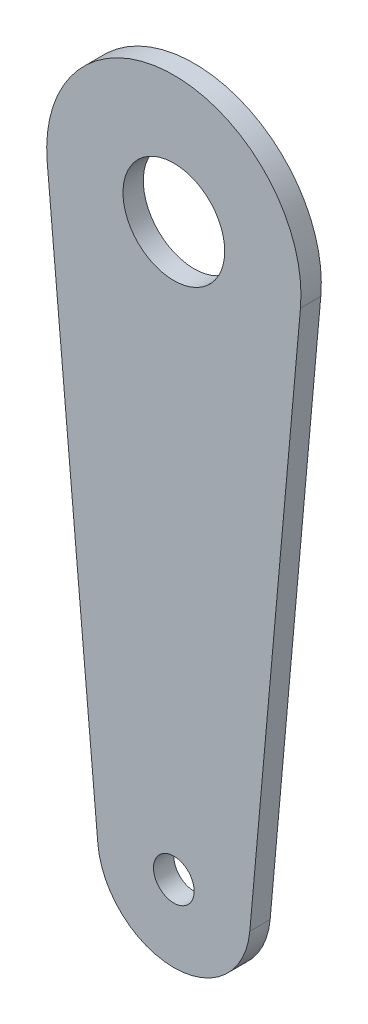
ISO-10303-21;
HEADER;
FILE_DESCRIPTION(('STEP AP214'),'2;1');
FILE_NAME('part.step','',(''),(''),'','','');
FILE_SCHEMA(('AUTOMOTIVE_DESIGN { 1 0 10303 214 1 1 1 1 }'));
ENDSEC;
DATA;
#1=APPLICATION_CONTEXT('core data for automotive mechanical design processes');
#2=APPLICATION_PROTOCOL_DEFINITION('international standard','automotive_design',2000,#1);
#3=PRODUCT_CONTEXT('',#1,'mechanical');
#4=PRODUCT('Part','Part','',(#3));
#5=PRODUCT_RELATED_PRODUCT_CATEGORY('part','',(#4));
#6=PRODUCT_DEFINITION_FORMATION('','',#4);
#7=PRODUCT_DEFINITION_CONTEXT('part definition',#1,'design');
#8=PRODUCT_DEFINITION('design','',#6,#7);
#9=PRODUCT_DEFINITION_SHAPE('','',#8);
#10=(LENGTH_UNIT() NAMED_UNIT(*) SI_UNIT(.MILLI.,.METRE.));
#11=(NAMED_UNIT(*) PLANE_ANGLE_UNIT() SI_UNIT($,.RADIAN.));
#12=(NAMED_UNIT(*) SI_UNIT($,.STERADIAN.) SOLID_ANGLE_UNIT());
#13=UNCERTAINTY_MEASURE_WITH_UNIT(LENGTH_MEASURE(1.E-05),#10,'distance_accuracy_value','');
#14=(GEOMETRIC_REPRESENTATION_CONTEXT(3) GLOBAL_UNCERTAINTY_ASSIGNED_CONTEXT((#13)) GLOBAL_UNIT_ASSIGNED_CONTEXT((#10,
#11,#12)) REPRESENTATION_CONTEXT('',''));
#15=CARTESIAN_POINT('',(0.,0.,0.));
#16=DIRECTION('',(0.,0.,1.));
#17=DIRECTION('',(1.,0.,0.));
#18=AXIS2_PLACEMENT_3D('',#15,#16,#17);
#19=CARTESIAN_POINT('',(15.9694452940245,-1.43156090561225,4.));
#20=DIRECTION('',(-0.996006054813167,0.0892857142857142,0.));
#21=DIRECTION('',(-0.0892857142857142,-0.996006054813167,0.));
#22=AXIS2_PLACEMENT_3D('',#19,#20,#21);
#23=PLANE('',#22);
#24=DIRECTION('',(0.0892857142857142,0.996006054813167,0.));
#25=VECTOR('',#24,1.);
#26=CARTESIAN_POINT('',(15.9694452940245,-1.43156090561225,0.));
#27=LINE('',#26,#25);
#28=CARTESIAN_POINT('',(14.9400908221975,-12.9142857142857,0.));
#29=VERTEX_POINT('',#28);
#30=CARTESIAN_POINT('',(24.9001513703292,98.1928571428572,0.));
#31=VERTEX_POINT('',#30);
#32=EDGE_CURVE('E121',#29,#31,#27,.T.);
#33=ORIENTED_EDGE('',*,*,#32,.T.);
#34=DIRECTION('',(0.,0.,-1.));
#35=VECTOR('',#34,1.);
#36=CARTESIAN_POINT('',(24.9001513703292,98.1928571428572,4.));
#37=LINE('',#36,#35);
#38=CARTESIAN_POINT('',(24.9001513703292,98.1928571428572,4.));
#39=VERTEX_POINT('',#38);
#40=EDGE_CURVE('E11',#39,#31,#37,.T.);
#41=ORIENTED_EDGE('',*,*,#40,.F.);
#42=DIRECTION('',(0.0892857142857142,0.996006054813167,0.));
#43=VECTOR('',#42,1.);
#44=CARTESIAN_POINT('',(15.9694452940245,-1.43156090561225,4.));
#45=LINE('',#44,#43);
#46=CARTESIAN_POINT('',(14.9400908221975,-12.9142857142857,4.));
#47=VERTEX_POINT('',#46);
#48=EDGE_CURVE('E96',#47,#39,#45,.T.);
#49=ORIENTED_EDGE('',*,*,#48,.F.);
#50=DIRECTION('',(0.,0.,-1.));
#51=VECTOR('',#50,1.);
#52=CARTESIAN_POINT('',(14.9400908221975,-12.9142857142857,4.));
#53=LINE('',#52,#51);
#54=EDGE_CURVE('E112',#47,#29,#53,.T.);
#55=ORIENTED_EDGE('',*,*,#54,.T.);
#56=EDGE_LOOP('',(#33,#41,#49,#55));
#57=FACE_BOUND('',#56,.T.);
#58=ADVANCED_FACE('F50',(#57),#23,.F.);
#59=CARTESIAN_POINT('',(0.,100.425,4.));
#60=DIRECTION('',(0.,0.,-1.));
#61=DIRECTION('',(-1.,0.,0.));
#62=AXIS2_PLACEMENT_3D('',#59,#60,#61);
#63=CYLINDRICAL_SURFACE('',#62,25.);
#64=CARTESIAN_POINT('',(0.,100.425,0.));
#65=DIRECTION('',(0.,0.,1.));
#66=DIRECTION('',(1.,0.,0.));
#67=AXIS2_PLACEMENT_3D('',#64,#65,#66);
#68=CIRCLE('',#67,25.);
#69=CARTESIAN_POINT('',(-24.9001513703292,98.1928571428572,0.));
#70=VERTEX_POINT('',#69);
#71=EDGE_CURVE('E105',#31,#70,#68,.T.);
#72=ORIENTED_EDGE('',*,*,#71,.T.);
#73=DIRECTION('',(0.,0.,-1.));
#74=VECTOR('',#73,1.);
#75=CARTESIAN_POINT('',(-24.9001513703292,98.1928571428572,4.));
#76=LINE('',#75,#74);
#77=CARTESIAN_POINT('',(-24.9001513703292,98.1928571428572,4.));
#78=VERTEX_POINT('',#77);
#79=EDGE_CURVE('E60',#78,#70,#76,.T.);
#80=ORIENTED_EDGE('',*,*,#79,.F.);
#81=CARTESIAN_POINT('',(0.,100.425,4.));
#82=DIRECTION('',(0.,0.,1.));
#83=DIRECTION('',(1.,0.,0.));
#84=AXIS2_PLACEMENT_3D('',#81,#82,#83);
#85=CIRCLE('',#84,25.);
#86=EDGE_CURVE('E91',#39,#78,#85,.T.);
#87=ORIENTED_EDGE('',*,*,#86,.F.);
#88=ORIENTED_EDGE('',*,*,#40,.T.);
#89=EDGE_LOOP('',(#72,#80,#87,#88));
#90=FACE_BOUND('',#89,.T.);
#91=ADVANCED_FACE('F102',(#90),#63,.T.);
#92=CARTESIAN_POINT('',(-15.9694452940245,-1.43156090561225,4.));
#93=DIRECTION('',(-0.996006054813167,-0.0892857142857145,0.));
#94=DIRECTION('',(0.0892857142857145,-0.996006054813167,0.));
#95=AXIS2_PLACEMENT_3D('',#92,#93,#94);
#96=PLANE('',#95);
#97=DIRECTION('',(-0.0892857142857144,0.996006054813167,0.));
#98=VECTOR('',#97,1.);
#99=CARTESIAN_POINT('',(-15.9694452940245,-1.43156090561225,0.));
#100=LINE('',#99,#98);
#101=CARTESIAN_POINT('',(-14.9400908221975,-12.9142857142857,0.));
#102=VERTEX_POINT('',#101);
#103=EDGE_CURVE('E129',#102,#70,#100,.T.);
#104=ORIENTED_EDGE('',*,*,#103,.F.);
#105=DIRECTION('',(0.,0.,-1.));
#106=VECTOR('',#105,1.);
#107=CARTESIAN_POINT('',(-14.9400908221975,-12.9142857142857,4.));
#108=LINE('',#107,#106);
#109=CARTESIAN_POINT('',(-14.9400908221975,-12.9142857142857,4.));
#110=VERTEX_POINT('',#109);
#111=EDGE_CURVE('E83',#110,#102,#108,.T.);
#112=ORIENTED_EDGE('',*,*,#111,.F.);
#113=DIRECTION('',(-0.0892857142857144,0.996006054813167,0.));
#114=VECTOR('',#113,1.);
#115=CARTESIAN_POINT('',(-15.9694452940245,-1.43156090561225,4.));
#116=LINE('',#115,#114);
#117=EDGE_CURVE('E92',#110,#78,#116,.T.);
#118=ORIENTED_EDGE('',*,*,#117,.T.);
#119=ORIENTED_EDGE('',*,*,#79,.T.);
#120=EDGE_LOOP('',(#104,#112,#118,#119));
#121=FACE_BOUND('',#120,.T.);
#122=ADVANCED_FACE('F110',(#121),#96,.T.);
#123=CARTESIAN_POINT('',(0.,100.425,4.));
#124=DIRECTION('',(0.,0.,-1.));
#125=DIRECTION('',(-1.,0.,0.));
#126=AXIS2_PLACEMENT_3D('',#123,#124,#125);
#127=CYLINDRICAL_SURFACE('',#126,10.);
#128=CARTESIAN_POINT('',(0.,100.425,4.));
#129=DIRECTION('',(0.,0.,1.));
#130=DIRECTION('',(1.,0.,0.));
#131=AXIS2_PLACEMENT_3D('',#128,#129,#130);
#132=CIRCLE('',#131,10.);
#133=CARTESIAN_POINT('',(10.,100.425,4.));
#134=VERTEX_POINT('',#133);
#135=EDGE_CURVE('E173',#134,#134,#132,.T.);
#136=ORIENTED_EDGE('',*,*,#135,.T.);
#137=EDGE_LOOP('',(#136));
#138=FACE_BOUND('',#137,.T.);
#139=CARTESIAN_POINT('',(0.,100.425,0.));
#140=DIRECTION('',(0.,0.,1.));
#141=DIRECTION('',(1.,0.,0.));
#142=AXIS2_PLACEMENT_3D('',#139,#140,#141);
#143=CIRCLE('',#142,10.);
#144=CARTESIAN_POINT('',(10.,100.425,0.));
#145=VERTEX_POINT('',#144);
#146=EDGE_CURVE('E117',#145,#145,#143,.T.);
#147=ORIENTED_EDGE('',*,*,#146,.F.);
#148=EDGE_LOOP('',(#147));
#149=FACE_BOUND('',#148,.T.);
#150=ADVANCED_FACE('F158',(#138,#149),#127,.F.);
#151=CARTESIAN_POINT('',(0.,-11.575,4.));
#152=DIRECTION('',(0.,0.,-1.));
#153=DIRECTION('',(-1.,0.,0.));
#154=AXIS2_PLACEMENT_3D('',#151,#152,#153);
#155=CYLINDRICAL_SURFACE('',#154,4.);
#156=CARTESIAN_POINT('',(0.,-11.575,4.));
#157=DIRECTION('',(0.,0.,1.));
#158=DIRECTION('',(1.,0.,0.));
#159=AXIS2_PLACEMENT_3D('',#156,#157,#158);
#160=CIRCLE('',#159,4.);
#161=CARTESIAN_POINT('',(4.00000000000001,-11.575,4.));
#162=VERTEX_POINT('',#161);
#163=EDGE_CURVE('E132',#162,#162,#160,.T.);
#164=ORIENTED_EDGE('',*,*,#163,.T.);
#165=EDGE_LOOP('',(#164));
#166=FACE_BOUND('',#165,.T.);
#167=CARTESIAN_POINT('',(0.,-11.575,0.));
#168=DIRECTION('',(0.,0.,1.));
#169=DIRECTION('',(1.,0.,0.));
#170=AXIS2_PLACEMENT_3D('',#167,#168,#169);
#171=CIRCLE('',#170,4.);
#172=CARTESIAN_POINT('',(4.00000000000001,-11.575,0.));
#173=VERTEX_POINT('',#172);
#174=EDGE_CURVE('E113',#173,#173,#171,.T.);
#175=ORIENTED_EDGE('',*,*,#174,.F.);
#176=EDGE_LOOP('',(#175));
#177=FACE_BOUND('',#176,.T.);
#178=ADVANCED_FACE('F47',(#166,#177),#155,.F.);
#179=CARTESIAN_POINT('',(0.,-11.575,4.));
#180=DIRECTION('',(0.,0.,-1.));
#181=DIRECTION('',(-1.,0.,0.));
#182=AXIS2_PLACEMENT_3D('',#179,#180,#181);
#183=CYLINDRICAL_SURFACE('',#182,15.);
#184=CARTESIAN_POINT('',(0.,-11.575,0.));
#185=DIRECTION('',(0.,0.,1.));
#186=DIRECTION('',(1.,0.,0.));
#187=AXIS2_PLACEMENT_3D('',#184,#185,#186);
#188=CIRCLE('',#187,15.);
#189=EDGE_CURVE('E84',#102,#29,#188,.T.);
#190=ORIENTED_EDGE('',*,*,#189,.T.);
#191=ORIENTED_EDGE('',*,*,#54,.F.);
#192=CARTESIAN_POINT('',(0.,-11.575,4.));
#193=DIRECTION('',(0.,0.,1.));
#194=DIRECTION('',(1.,0.,0.));
#195=AXIS2_PLACEMENT_3D('',#192,#193,#194);
#196=CIRCLE('',#195,15.);
#197=EDGE_CURVE('E64',#110,#47,#196,.T.);
#198=ORIENTED_EDGE('',*,*,#197,.F.);
#199=ORIENTED_EDGE('',*,*,#111,.T.);
#200=EDGE_LOOP('',(#190,#191,#198,#199));
#201=FACE_BOUND('',#200,.T.);
#202=ADVANCED_FACE('F149',(#201),#183,.T.);
#203=CARTESIAN_POINT('',(0.,0.,4.));
#204=DIRECTION('',(0.,0.,1.));
#205=DIRECTION('',(1.,0.,0.));
#206=AXIS2_PLACEMENT_3D('',#203,#204,#205);
#207=PLANE('',#206);
#208=ORIENTED_EDGE('',*,*,#163,.F.);
#209=EDGE_LOOP('',(#208));
#210=FACE_BOUND('',#209,.T.);
#211=ORIENTED_EDGE('',*,*,#135,.F.);
#212=EDGE_LOOP('',(#211));
#213=FACE_BOUND('',#212,.T.);
#214=ORIENTED_EDGE('',*,*,#48,.T.);
#215=ORIENTED_EDGE('',*,*,#86,.T.);
#216=ORIENTED_EDGE('',*,*,#117,.F.);
#217=ORIENTED_EDGE('',*,*,#197,.T.);
#218=EDGE_LOOP('',(#214,#215,#216,#217));
#219=FACE_BOUND('',#218,.T.);
#220=ADVANCED_FACE('F95',(#210,#213,#219),#207,.T.);
#221=CARTESIAN_POINT('',(0.,0.,0.));
#222=DIRECTION('',(0.,0.,1.));
#223=DIRECTION('',(1.,0.,0.));
#224=AXIS2_PLACEMENT_3D('',#221,#222,#223);
#225=PLANE('',#224);
#226=ORIENTED_EDGE('',*,*,#174,.T.);
#227=EDGE_LOOP('',(#226));
#228=FACE_BOUND('',#227,.T.);
#229=ORIENTED_EDGE('',*,*,#146,.T.);
#230=EDGE_LOOP('',(#229));
#231=FACE_BOUND('',#230,.T.);
#232=ORIENTED_EDGE('',*,*,#32,.F.);
#233=ORIENTED_EDGE('',*,*,#189,.F.);
#234=ORIENTED_EDGE('',*,*,#103,.T.);
#235=ORIENTED_EDGE('',*,*,#71,.F.);
#236=EDGE_LOOP('',(#232,#233,#234,#235));
#237=FACE_BOUND('',#236,.T.);
#238=ADVANCED_FACE('F141',(#228,#231,#237),#225,.F.);
#239=CLOSED_SHELL('',(#58,#91,#122,#150,#178,#202,#220,#238));
#240=MANIFOLD_SOLID_BREP('B2',#239);
#241=ADVANCED_BREP_SHAPE_REPRESENTATION('',(#18,#240),#14);
#242=SHAPE_DEFINITION_REPRESENTATION(#9,#241);
ENDSEC;
END-ISO-10303-21;
